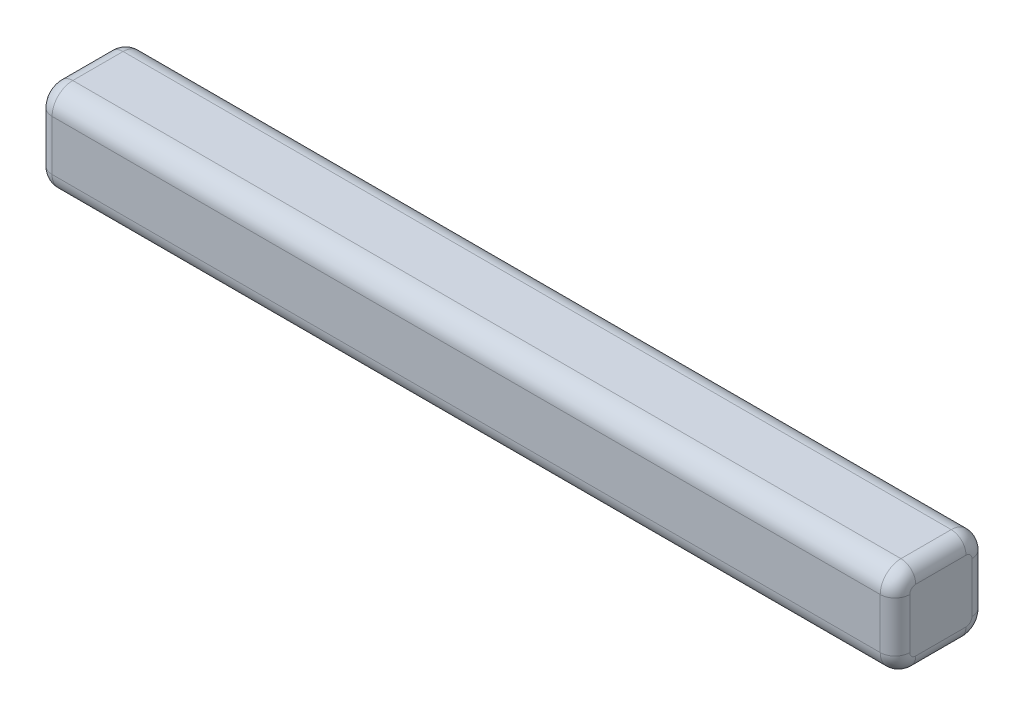
ISO-10303-21;
HEADER;
FILE_DESCRIPTION(('STEP AP214'),'2;1');
FILE_NAME('part.step','',(''),(''),'','','');
FILE_SCHEMA(('AUTOMOTIVE_DESIGN { 1 0 10303 214 1 1 1 1 }'));
ENDSEC;
DATA;
#1=APPLICATION_CONTEXT('core data for automotive mechanical design processes');
#2=APPLICATION_PROTOCOL_DEFINITION('international standard','automotive_design',2000,#1);
#3=PRODUCT_CONTEXT('',#1,'mechanical');
#4=PRODUCT('Part','Part','',(#3));
#5=PRODUCT_RELATED_PRODUCT_CATEGORY('part','',(#4));
#6=PRODUCT_DEFINITION_FORMATION('','',#4);
#7=PRODUCT_DEFINITION_CONTEXT('part definition',#1,'design');
#8=PRODUCT_DEFINITION('design','',#6,#7);
#9=PRODUCT_DEFINITION_SHAPE('','',#8);
#10=(LENGTH_UNIT() NAMED_UNIT(*) SI_UNIT(.MILLI.,.METRE.));
#11=(NAMED_UNIT(*) PLANE_ANGLE_UNIT() SI_UNIT($,.RADIAN.));
#12=(NAMED_UNIT(*) SI_UNIT($,.STERADIAN.) SOLID_ANGLE_UNIT());
#13=UNCERTAINTY_MEASURE_WITH_UNIT(LENGTH_MEASURE(1.E-05),#10,'distance_accuracy_value','');
#14=(GEOMETRIC_REPRESENTATION_CONTEXT(3) GLOBAL_UNCERTAINTY_ASSIGNED_CONTEXT((#13)) GLOBAL_UNIT_ASSIGNED_CONTEXT((#10,
#11,#12)) REPRESENTATION_CONTEXT('',''));
#15=CARTESIAN_POINT('',(0.,0.,0.));
#16=DIRECTION('',(0.,0.,1.));
#17=DIRECTION('',(1.,0.,0.));
#18=AXIS2_PLACEMENT_3D('',#15,#16,#17);
#19=CARTESIAN_POINT('',(11.4400713575457,0.,0.));
#20=DIRECTION('',(1.,0.,0.));
#21=DIRECTION('',(0.,0.,-1.));
#22=AXIS2_PLACEMENT_3D('',#19,#20,#21);
#23=PLANE('',#22);
#24=DIRECTION('',(0.,-1.,0.));
#25=VECTOR('',#24,1.);
#26=CARTESIAN_POINT('',(11.4400713575457,0.,39.8435567964381));
#27=LINE('',#26,#25);
#28=CARTESIAN_POINT('',(11.4400713575457,141.724028512687,39.8435567964381));
#29=VERTEX_POINT('',#28);
#30=CARTESIAN_POINT('',(11.4400713575457,143.424028512687,39.8435567964381));
#31=VERTEX_POINT('',#30);
#32=EDGE_CURVE('E50',#29,#31,#27,.F.);
#33=ORIENTED_EDGE('',*,*,#32,.T.);
#34=CARTESIAN_POINT('',(11.4400713575457,143.424028512687,39.6435567964381));
#35=DIRECTION('',(1.,0.,0.));
#36=DIRECTION('',(0.,0.,-1.));
#37=AXIS2_PLACEMENT_3D('',#34,#35,#36);
#38=CIRCLE('',#37,0.2);
#39=CARTESIAN_POINT('',(11.4400713575457,143.624028512687,39.6435567964381));
#40=VERTEX_POINT('',#39);
#41=EDGE_CURVE('E11',#31,#40,#38,.F.);
#42=ORIENTED_EDGE('',*,*,#41,.T.);
#43=DIRECTION('',(0.,0.,1.));
#44=VECTOR('',#43,1.);
#45=CARTESIAN_POINT('',(11.4400713575457,143.624028512687,0.));
#46=LINE('',#45,#44);
#47=CARTESIAN_POINT('',(11.4400713575457,143.624028512687,37.9435567964381));
#48=VERTEX_POINT('',#47);
#49=EDGE_CURVE('E217',#40,#48,#46,.F.);
#50=ORIENTED_EDGE('',*,*,#49,.T.);
#51=CARTESIAN_POINT('',(11.4400713575457,143.424028512687,37.9435567964381));
#52=DIRECTION('',(1.,0.,0.));
#53=DIRECTION('',(0.,0.,-1.));
#54=AXIS2_PLACEMENT_3D('',#51,#52,#53);
#55=CIRCLE('',#54,0.2);
#56=CARTESIAN_POINT('',(11.4400713575457,143.424028512687,37.7435567964381));
#57=VERTEX_POINT('',#56);
#58=EDGE_CURVE('E219',#48,#57,#55,.F.);
#59=ORIENTED_EDGE('',*,*,#58,.T.);
#60=DIRECTION('',(0.,1.,0.));
#61=VECTOR('',#60,1.);
#62=CARTESIAN_POINT('',(11.4400713575457,0.,37.7435567964381));
#63=LINE('',#62,#61);
#64=CARTESIAN_POINT('',(11.4400713575457,141.724028512687,37.7435567964381));
#65=VERTEX_POINT('',#64);
#66=EDGE_CURVE('E221',#57,#65,#63,.F.);
#67=ORIENTED_EDGE('',*,*,#66,.T.);
#68=CARTESIAN_POINT('',(11.4400713575457,141.724028512687,37.9435567964381));
#69=DIRECTION('',(1.,0.,0.));
#70=DIRECTION('',(0.,0.,-1.));
#71=AXIS2_PLACEMENT_3D('',#68,#69,#70);
#72=CIRCLE('',#71,0.2);
#73=CARTESIAN_POINT('',(11.4400713575457,141.524028512687,37.9435567964381));
#74=VERTEX_POINT('',#73);
#75=EDGE_CURVE('E223',#65,#74,#72,.F.);
#76=ORIENTED_EDGE('',*,*,#75,.T.);
#77=DIRECTION('',(0.,0.,-1.));
#78=VECTOR('',#77,1.);
#79=CARTESIAN_POINT('',(11.4400713575457,141.524028512687,0.));
#80=LINE('',#79,#78);
#81=CARTESIAN_POINT('',(11.4400713575457,141.524028512687,39.6435567964381));
#82=VERTEX_POINT('',#81);
#83=EDGE_CURVE('E225',#74,#82,#80,.F.);
#84=ORIENTED_EDGE('',*,*,#83,.T.);
#85=CARTESIAN_POINT('',(11.4400713575457,141.724028512687,39.6435567964381));
#86=DIRECTION('',(1.,0.,0.));
#87=DIRECTION('',(0.,0.,-1.));
#88=AXIS2_PLACEMENT_3D('',#85,#86,#87);
#89=CIRCLE('',#88,0.2);
#90=EDGE_CURVE('E61',#82,#29,#89,.F.);
#91=ORIENTED_EDGE('',*,*,#90,.T.);
#92=EDGE_LOOP('',(#33,#42,#50,#59,#67,#76,#84,#91));
#93=FACE_BOUND('',#92,.T.);
#94=ADVANCED_FACE('F41',(#93),#23,.F.);
#95=CARTESIAN_POINT('',(44.8241334009023,144.124028512687,42.7935567964381));
#96=DIRECTION('',(0.,-1.,0.));
#97=DIRECTION('',(0.,0.,-1.));
#98=AXIS2_PLACEMENT_3D('',#95,#96,#97);
#99=PLANE('',#98);
#100=DIRECTION('',(-1.,0.,0.));
#101=VECTOR('',#100,1.);
#102=CARTESIAN_POINT('',(44.8241334009023,144.124028512687,39.6435567964381));
#103=LINE('',#102,#101);
#104=CARTESIAN_POINT('',(11.9400713575457,144.124028512687,39.6435567964381));
#105=VERTEX_POINT('',#104);
#106=CARTESIAN_POINT('',(39.9400713575457,144.124028512687,39.6435567964381));
#107=VERTEX_POINT('',#106);
#108=EDGE_CURVE('E246',#105,#107,#103,.F.);
#109=ORIENTED_EDGE('',*,*,#108,.T.);
#110=DIRECTION('',(0.,0.,-1.));
#111=VECTOR('',#110,1.);
#112=CARTESIAN_POINT('',(39.9400713575457,144.124028512687,42.7935567964381));
#113=LINE('',#112,#111);
#114=CARTESIAN_POINT('',(39.9400713575457,144.124028512687,37.9435567964381));
#115=VERTEX_POINT('',#114);
#116=EDGE_CURVE('E207',#107,#115,#113,.T.);
#117=ORIENTED_EDGE('',*,*,#116,.T.);
#118=DIRECTION('',(-1.,0.,0.));
#119=VECTOR('',#118,1.);
#120=CARTESIAN_POINT('',(44.8241334009023,144.124028512687,37.9435567964381));
#121=LINE('',#120,#119);
#122=CARTESIAN_POINT('',(11.9400713575457,144.124028512687,37.9435567964381));
#123=VERTEX_POINT('',#122);
#124=EDGE_CURVE('E290',#115,#123,#121,.T.);
#125=ORIENTED_EDGE('',*,*,#124,.T.);
#126=DIRECTION('',(0.,0.,1.));
#127=VECTOR('',#126,1.);
#128=CARTESIAN_POINT('',(11.9400713575457,144.124028512687,42.7935567964381));
#129=LINE('',#128,#127);
#130=EDGE_CURVE('E205',#123,#105,#129,.T.);
#131=ORIENTED_EDGE('',*,*,#130,.T.);
#132=EDGE_LOOP('',(#109,#117,#125,#131));
#133=FACE_BOUND('',#132,.T.);
#134=ADVANCED_FACE('F353',(#133),#99,.F.);
#135=CARTESIAN_POINT('',(44.8241334009023,-16.4259714873127,37.2435567964381));
#136=DIRECTION('',(0.,0.,1.));
#137=DIRECTION('',(1.,0.,0.));
#138=AXIS2_PLACEMENT_3D('',#135,#136,#137);
#139=PLANE('',#138);
#140=DIRECTION('',(-1.,0.,0.));
#141=VECTOR('',#140,1.);
#142=CARTESIAN_POINT('',(44.8241334009023,143.424028512687,37.2435567964381));
#143=LINE('',#142,#141);
#144=CARTESIAN_POINT('',(11.9400713575457,143.424028512687,37.2435567964381));
#145=VERTEX_POINT('',#144);
#146=CARTESIAN_POINT('',(39.9400713575457,143.424028512687,37.2435567964381));
#147=VERTEX_POINT('',#146);
#148=EDGE_CURVE('E289',#145,#147,#143,.F.);
#149=ORIENTED_EDGE('',*,*,#148,.T.);
#150=DIRECTION('',(0.,-1.,0.));
#151=VECTOR('',#150,1.);
#152=CARTESIAN_POINT('',(39.9400713575457,-16.4259714873127,37.2435567964381));
#153=LINE('',#152,#151);
#154=CARTESIAN_POINT('',(39.9400713575457,141.724028512687,37.2435567964381));
#155=VERTEX_POINT('',#154);
#156=EDGE_CURVE('E215',#147,#155,#153,.T.);
#157=ORIENTED_EDGE('',*,*,#156,.T.);
#158=DIRECTION('',(-1.,0.,0.));
#159=VECTOR('',#158,1.);
#160=CARTESIAN_POINT('',(44.8241334009023,141.724028512687,37.2435567964381));
#161=LINE('',#160,#159);
#162=CARTESIAN_POINT('',(11.9400713575457,141.724028512687,37.2435567964381));
#163=VERTEX_POINT('',#162);
#164=EDGE_CURVE('E283',#155,#163,#161,.T.);
#165=ORIENTED_EDGE('',*,*,#164,.T.);
#166=DIRECTION('',(0.,1.,0.));
#167=VECTOR('',#166,1.);
#168=CARTESIAN_POINT('',(11.9400713575457,-16.4259714873127,37.2435567964381));
#169=LINE('',#168,#167);
#170=EDGE_CURVE('E213',#163,#145,#169,.T.);
#171=ORIENTED_EDGE('',*,*,#170,.T.);
#172=EDGE_LOOP('',(#149,#157,#165,#171));
#173=FACE_BOUND('',#172,.T.);
#174=ADVANCED_FACE('F287',(#173),#139,.F.);
#175=CARTESIAN_POINT('',(44.8241334009023,141.024028512687,42.7935567964381));
#176=DIRECTION('',(0.,1.,0.));
#177=DIRECTION('',(0.,0.,1.));
#178=AXIS2_PLACEMENT_3D('',#175,#176,#177);
#179=PLANE('',#178);
#180=DIRECTION('',(-1.,0.,0.));
#181=VECTOR('',#180,1.);
#182=CARTESIAN_POINT('',(44.8241334009023,141.024028512687,37.9435567964381));
#183=LINE('',#182,#181);
#184=CARTESIAN_POINT('',(11.9400713575457,141.024028512687,37.9435567964381));
#185=VERTEX_POINT('',#184);
#186=CARTESIAN_POINT('',(39.9400713575457,141.024028512687,37.9435567964381));
#187=VERTEX_POINT('',#186);
#188=EDGE_CURVE('E174',#185,#187,#183,.F.);
#189=ORIENTED_EDGE('',*,*,#188,.T.);
#190=DIRECTION('',(0.,0.,1.));
#191=VECTOR('',#190,1.);
#192=CARTESIAN_POINT('',(39.9400713575457,141.024028512687,42.7935567964381));
#193=LINE('',#192,#191);
#194=CARTESIAN_POINT('',(39.9400713575457,141.024028512687,39.6435567964381));
#195=VERTEX_POINT('',#194);
#196=EDGE_CURVE('E190',#187,#195,#193,.T.);
#197=ORIENTED_EDGE('',*,*,#196,.T.);
#198=DIRECTION('',(-1.,0.,0.));
#199=VECTOR('',#198,1.);
#200=CARTESIAN_POINT('',(44.8241334009023,141.024028512687,39.6435567964381));
#201=LINE('',#200,#199);
#202=CARTESIAN_POINT('',(11.9400713575457,141.024028512687,39.6435567964381));
#203=VERTEX_POINT('',#202);
#204=EDGE_CURVE('E303',#195,#203,#201,.T.);
#205=ORIENTED_EDGE('',*,*,#204,.T.);
#206=DIRECTION('',(0.,0.,-1.));
#207=VECTOR('',#206,1.);
#208=CARTESIAN_POINT('',(11.9400713575457,141.024028512687,42.7935567964381));
#209=LINE('',#208,#207);
#210=EDGE_CURVE('E188',#203,#185,#209,.T.);
#211=ORIENTED_EDGE('',*,*,#210,.T.);
#212=EDGE_LOOP('',(#189,#197,#205,#211));
#213=FACE_BOUND('',#212,.T.);
#214=ADVANCED_FACE('F325',(#213),#179,.F.);
#215=CARTESIAN_POINT('',(44.8241334009023,-16.4259714873127,40.3435567964381));
#216=DIRECTION('',(0.,0.,-1.));
#217=DIRECTION('',(-1.,0.,0.));
#218=AXIS2_PLACEMENT_3D('',#215,#216,#217);
#219=PLANE('',#218);
#220=DIRECTION('',(-1.,0.,0.));
#221=VECTOR('',#220,1.);
#222=CARTESIAN_POINT('',(44.8241334009023,141.724028512687,40.3435567964381));
#223=LINE('',#222,#221);
#224=CARTESIAN_POINT('',(11.9400713575457,141.724028512687,40.3435567964381));
#225=VERTEX_POINT('',#224);
#226=CARTESIAN_POINT('',(39.9400713575457,141.724028512687,40.3435567964381));
#227=VERTEX_POINT('',#226);
#228=EDGE_CURVE('E292',#225,#227,#223,.F.);
#229=ORIENTED_EDGE('',*,*,#228,.T.);
#230=DIRECTION('',(0.,1.,0.));
#231=VECTOR('',#230,1.);
#232=CARTESIAN_POINT('',(39.9400713575457,-16.4259714873127,40.3435567964381));
#233=LINE('',#232,#231);
#234=CARTESIAN_POINT('',(39.9400713575457,143.424028512687,40.3435567964381));
#235=VERTEX_POINT('',#234);
#236=EDGE_CURVE('E198',#227,#235,#233,.T.);
#237=ORIENTED_EDGE('',*,*,#236,.T.);
#238=DIRECTION('',(-1.,0.,0.));
#239=VECTOR('',#238,1.);
#240=CARTESIAN_POINT('',(44.8241334009023,143.424028512687,40.3435567964381));
#241=LINE('',#240,#239);
#242=CARTESIAN_POINT('',(11.9400713575457,143.424028512687,40.3435567964381));
#243=VERTEX_POINT('',#242);
#244=EDGE_CURVE('E300',#235,#243,#241,.T.);
#245=ORIENTED_EDGE('',*,*,#244,.T.);
#246=DIRECTION('',(0.,-1.,0.));
#247=VECTOR('',#246,1.);
#248=CARTESIAN_POINT('',(11.9400713575457,-16.4259714873127,40.3435567964381));
#249=LINE('',#248,#247);
#250=EDGE_CURVE('E196',#243,#225,#249,.T.);
#251=ORIENTED_EDGE('',*,*,#250,.T.);
#252=EDGE_LOOP('',(#229,#237,#245,#251));
#253=FACE_BOUND('',#252,.T.);
#254=ADVANCED_FACE('F369',(#253),#219,.F.);
#255=CARTESIAN_POINT('',(40.4400713575457,-16.4259714873127,42.7935567964381));
#256=DIRECTION('',(-1.,0.,0.));
#257=DIRECTION('',(0.,0.,1.));
#258=AXIS2_PLACEMENT_3D('',#255,#256,#257);
#259=PLANE('',#258);
#260=DIRECTION('',(0.,0.,1.));
#261=VECTOR('',#260,1.);
#262=CARTESIAN_POINT('',(40.4400713575457,141.524028512687,42.7935567964381));
#263=LINE('',#262,#261);
#264=CARTESIAN_POINT('',(40.4400713575457,141.524028512687,39.6435567964381));
#265=VERTEX_POINT('',#264);
#266=CARTESIAN_POINT('',(40.4400713575457,141.524028512687,37.9435567964381));
#267=VERTEX_POINT('',#266);
#268=EDGE_CURVE('E178',#265,#267,#263,.F.);
#269=ORIENTED_EDGE('',*,*,#268,.T.);
#270=CARTESIAN_POINT('',(40.4400713575457,141.724028512687,37.9435567964381));
#271=DIRECTION('',(-1.,0.,0.));
#272=DIRECTION('',(0.,0.,1.));
#273=AXIS2_PLACEMENT_3D('',#270,#271,#272);
#274=CIRCLE('',#273,0.2);
#275=CARTESIAN_POINT('',(40.4400713575457,141.724028512687,37.7435567964381));
#276=VERTEX_POINT('',#275);
#277=EDGE_CURVE('E159',#267,#276,#274,.F.);
#278=ORIENTED_EDGE('',*,*,#277,.T.);
#279=DIRECTION('',(0.,-1.,0.));
#280=VECTOR('',#279,1.);
#281=CARTESIAN_POINT('',(40.4400713575457,-16.4259714873127,37.7435567964381));
#282=LINE('',#281,#280);
#283=CARTESIAN_POINT('',(40.4400713575457,143.424028512687,37.7435567964381));
#284=VERTEX_POINT('',#283);
#285=EDGE_CURVE('E167',#276,#284,#282,.F.);
#286=ORIENTED_EDGE('',*,*,#285,.T.);
#287=CARTESIAN_POINT('',(40.4400713575457,143.424028512687,37.9435567964381));
#288=DIRECTION('',(-1.,0.,0.));
#289=DIRECTION('',(0.,0.,1.));
#290=AXIS2_PLACEMENT_3D('',#287,#288,#289);
#291=CIRCLE('',#290,0.2);
#292=CARTESIAN_POINT('',(40.4400713575457,143.624028512687,37.9435567964381));
#293=VERTEX_POINT('',#292);
#294=EDGE_CURVE('E173',#284,#293,#291,.F.);
#295=ORIENTED_EDGE('',*,*,#294,.T.);
#296=DIRECTION('',(0.,0.,-1.));
#297=VECTOR('',#296,1.);
#298=CARTESIAN_POINT('',(40.4400713575457,143.624028512687,42.7935567964381));
#299=LINE('',#298,#297);
#300=CARTESIAN_POINT('',(40.4400713575457,143.624028512687,39.6435567964381));
#301=VERTEX_POINT('',#300);
#302=EDGE_CURVE('E308',#293,#301,#299,.F.);
#303=ORIENTED_EDGE('',*,*,#302,.T.);
#304=CARTESIAN_POINT('',(40.4400713575457,143.424028512687,39.6435567964381));
#305=DIRECTION('',(-1.,0.,0.));
#306=DIRECTION('',(0.,0.,1.));
#307=AXIS2_PLACEMENT_3D('',#304,#305,#306);
#308=CIRCLE('',#307,0.2);
#309=CARTESIAN_POINT('',(40.4400713575457,143.424028512687,39.8435567964381));
#310=VERTEX_POINT('',#309);
#311=EDGE_CURVE('E310',#301,#310,#308,.F.);
#312=ORIENTED_EDGE('',*,*,#311,.T.);
#313=DIRECTION('',(0.,1.,0.));
#314=VECTOR('',#313,1.);
#315=CARTESIAN_POINT('',(40.4400713575457,-16.4259714873127,39.8435567964381));
#316=LINE('',#315,#314);
#317=CARTESIAN_POINT('',(40.4400713575457,141.724028512687,39.8435567964381));
#318=VERTEX_POINT('',#317);
#319=EDGE_CURVE('E312',#310,#318,#316,.F.);
#320=ORIENTED_EDGE('',*,*,#319,.T.);
#321=CARTESIAN_POINT('',(40.4400713575457,141.724028512687,39.6435567964381));
#322=DIRECTION('',(-1.,0.,0.));
#323=DIRECTION('',(0.,0.,1.));
#324=AXIS2_PLACEMENT_3D('',#321,#322,#323);
#325=CIRCLE('',#324,0.2);
#326=EDGE_CURVE('E183',#318,#265,#325,.F.);
#327=ORIENTED_EDGE('',*,*,#326,.T.);
#328=EDGE_LOOP('',(#269,#278,#286,#295,#303,#312,#320,#327));
#329=FACE_BOUND('',#328,.T.);
#330=ADVANCED_FACE('F176',(#329),#259,.F.);
#331=CARTESIAN_POINT('',(44.8241334009023,143.424028512687,37.9435567964381));
#332=DIRECTION('',(-1.,0.,0.));
#333=DIRECTION('',(0.,0.,1.));
#334=AXIS2_PLACEMENT_3D('',#331,#332,#333);
#335=CYLINDRICAL_SURFACE('',#334,0.7);
#336=ORIENTED_EDGE('',*,*,#124,.F.);
#337=CARTESIAN_POINT('',(39.9400713575457,143.424028512687,37.9435567964381));
#338=DIRECTION('',(-1.,0.,0.));
#339=DIRECTION('',(0.,0.,1.));
#340=AXIS2_PLACEMENT_3D('',#337,#338,#339);
#341=CIRCLE('',#340,0.7);
#342=EDGE_CURVE('E211',#115,#147,#341,.T.);
#343=ORIENTED_EDGE('',*,*,#342,.T.);
#344=ORIENTED_EDGE('',*,*,#148,.F.);
#345=CARTESIAN_POINT('',(11.9400713575457,143.424028512687,37.9435567964381));
#346=DIRECTION('',(1.,0.,0.));
#347=DIRECTION('',(0.,0.,-1.));
#348=AXIS2_PLACEMENT_3D('',#345,#346,#347);
#349=CIRCLE('',#348,0.7);
#350=EDGE_CURVE('E209',#145,#123,#349,.T.);
#351=ORIENTED_EDGE('',*,*,#350,.T.);
#352=EDGE_LOOP('',(#336,#343,#344,#351));
#353=FACE_BOUND('',#352,.T.);
#354=ADVANCED_FACE('F376',(#353),#335,.T.);
#355=CARTESIAN_POINT('',(44.8241334009023,143.424028512687,39.6435567964381));
#356=DIRECTION('',(-1.,0.,0.));
#357=DIRECTION('',(0.,0.,1.));
#358=AXIS2_PLACEMENT_3D('',#355,#356,#357);
#359=CYLINDRICAL_SURFACE('',#358,0.7);
#360=ORIENTED_EDGE('',*,*,#244,.F.);
#361=CARTESIAN_POINT('',(39.9400713575457,143.424028512687,39.6435567964381));
#362=DIRECTION('',(-1.,0.,0.));
#363=DIRECTION('',(0.,0.,1.));
#364=AXIS2_PLACEMENT_3D('',#361,#362,#363);
#365=CIRCLE('',#364,0.7);
#366=EDGE_CURVE('E203',#235,#107,#365,.T.);
#367=ORIENTED_EDGE('',*,*,#366,.T.);
#368=ORIENTED_EDGE('',*,*,#108,.F.);
#369=CARTESIAN_POINT('',(11.9400713575457,143.424028512687,39.6435567964381));
#370=DIRECTION('',(1.,0.,0.));
#371=DIRECTION('',(0.,0.,-1.));
#372=AXIS2_PLACEMENT_3D('',#369,#370,#371);
#373=CIRCLE('',#372,0.7);
#374=EDGE_CURVE('E200',#105,#243,#373,.T.);
#375=ORIENTED_EDGE('',*,*,#374,.T.);
#376=EDGE_LOOP('',(#360,#367,#368,#375));
#377=FACE_BOUND('',#376,.T.);
#378=ADVANCED_FACE('F358',(#377),#359,.T.);
#379=CARTESIAN_POINT('',(44.8241334009023,141.724028512687,37.9435567964381));
#380=DIRECTION('',(-1.,0.,0.));
#381=DIRECTION('',(0.,0.,1.));
#382=AXIS2_PLACEMENT_3D('',#379,#380,#381);
#383=CYLINDRICAL_SURFACE('',#382,0.7);
#384=ORIENTED_EDGE('',*,*,#164,.F.);
#385=CARTESIAN_POINT('',(39.9400713575457,141.724028512687,37.9435567964381));
#386=DIRECTION('',(-1.,0.,0.));
#387=DIRECTION('',(0.,0.,1.));
#388=AXIS2_PLACEMENT_3D('',#385,#386,#387);
#389=CIRCLE('',#388,0.7);
#390=EDGE_CURVE('E161',#155,#187,#389,.T.);
#391=ORIENTED_EDGE('',*,*,#390,.T.);
#392=ORIENTED_EDGE('',*,*,#188,.F.);
#393=CARTESIAN_POINT('',(11.9400713575457,141.724028512687,37.9435567964381));
#394=DIRECTION('',(1.,0.,0.));
#395=DIRECTION('',(0.,0.,-1.));
#396=AXIS2_PLACEMENT_3D('',#393,#394,#395);
#397=CIRCLE('',#396,0.7);
#398=EDGE_CURVE('E180',#185,#163,#397,.T.);
#399=ORIENTED_EDGE('',*,*,#398,.T.);
#400=EDGE_LOOP('',(#384,#391,#392,#399));
#401=FACE_BOUND('',#400,.T.);
#402=ADVANCED_FACE('F282',(#401),#383,.T.);
#403=CARTESIAN_POINT('',(44.8241334009023,141.724028512687,39.6435567964381));
#404=DIRECTION('',(-1.,0.,0.));
#405=DIRECTION('',(0.,0.,1.));
#406=AXIS2_PLACEMENT_3D('',#403,#404,#405);
#407=CYLINDRICAL_SURFACE('',#406,0.7);
#408=ORIENTED_EDGE('',*,*,#204,.F.);
#409=CARTESIAN_POINT('',(39.9400713575457,141.724028512687,39.6435567964381));
#410=DIRECTION('',(-1.,0.,0.));
#411=DIRECTION('',(0.,0.,1.));
#412=AXIS2_PLACEMENT_3D('',#409,#410,#411);
#413=CIRCLE('',#412,0.7);
#414=EDGE_CURVE('E194',#195,#227,#413,.T.);
#415=ORIENTED_EDGE('',*,*,#414,.T.);
#416=ORIENTED_EDGE('',*,*,#228,.F.);
#417=CARTESIAN_POINT('',(11.9400713575457,141.724028512687,39.6435567964381));
#418=DIRECTION('',(1.,0.,0.));
#419=DIRECTION('',(0.,0.,-1.));
#420=AXIS2_PLACEMENT_3D('',#417,#418,#419);
#421=CIRCLE('',#420,0.7);
#422=EDGE_CURVE('E192',#225,#203,#421,.T.);
#423=ORIENTED_EDGE('',*,*,#422,.T.);
#424=EDGE_LOOP('',(#408,#415,#416,#423));
#425=FACE_BOUND('',#424,.T.);
#426=ADVANCED_FACE('F327',(#425),#407,.T.);
#427=CARTESIAN_POINT('',(39.9400713575457,143.424028512687,39.6435567964381));
#428=DIRECTION('',(-1.,0.,0.));
#429=DIRECTION('',(0.,0.,1.));
#430=AXIS2_PLACEMENT_3D('',#427,#428,#429);
#431=DEGENERATE_TOROIDAL_SURFACE('',#430,0.2,0.5,.T.);
#432=CARTESIAN_POINT('',(39.9400713575457,143.624028512687,39.6435567964381));
#433=DIRECTION('',(0.,0.,-1.));
#434=DIRECTION('',(-1.,0.,0.));
#435=AXIS2_PLACEMENT_3D('',#432,#433,#434);
#436=CIRCLE('',#435,0.5);
#437=EDGE_CURVE('E240',#107,#301,#436,.T.);
#438=ORIENTED_EDGE('',*,*,#437,.F.);
#439=ORIENTED_EDGE('',*,*,#366,.F.);
#440=CARTESIAN_POINT('',(39.9400713575457,143.424028512687,39.8435567964381));
#441=DIRECTION('',(0.,-1.,0.));
#442=DIRECTION('',(0.,0.,-1.));
#443=AXIS2_PLACEMENT_3D('',#440,#441,#442);
#444=CIRCLE('',#443,0.5);
#445=EDGE_CURVE('E243',#310,#235,#444,.T.);
#446=ORIENTED_EDGE('',*,*,#445,.F.);
#447=ORIENTED_EDGE('',*,*,#311,.F.);
#448=EDGE_LOOP('',(#438,#439,#446,#447));
#449=FACE_BOUND('',#448,.T.);
#450=ADVANCED_FACE('F362',(#449),#431,.T.);
#451=CARTESIAN_POINT('',(39.9400713575457,-16.4259714873127,39.8435567964381));
#452=DIRECTION('',(0.,1.,0.));
#453=DIRECTION('',(0.,0.,1.));
#454=AXIS2_PLACEMENT_3D('',#451,#452,#453);
#455=CYLINDRICAL_SURFACE('',#454,0.5);
#456=ORIENTED_EDGE('',*,*,#445,.T.);
#457=ORIENTED_EDGE('',*,*,#236,.F.);
#458=CARTESIAN_POINT('',(39.9400713575457,141.724028512687,39.8435567964381));
#459=DIRECTION('',(0.,-1.,0.));
#460=DIRECTION('',(0.,0.,-1.));
#461=AXIS2_PLACEMENT_3D('',#458,#459,#460);
#462=CIRCLE('',#461,0.5);
#463=EDGE_CURVE('E237',#318,#227,#462,.T.);
#464=ORIENTED_EDGE('',*,*,#463,.F.);
#465=ORIENTED_EDGE('',*,*,#319,.F.);
#466=EDGE_LOOP('',(#456,#457,#464,#465));
#467=FACE_BOUND('',#466,.T.);
#468=ADVANCED_FACE('F367',(#467),#455,.T.);
#469=CARTESIAN_POINT('',(39.9400713575457,143.624028512687,42.7935567964381));
#470=DIRECTION('',(0.,0.,-1.));
#471=DIRECTION('',(-1.,0.,0.));
#472=AXIS2_PLACEMENT_3D('',#469,#470,#471);
#473=CYLINDRICAL_SURFACE('',#472,0.5);
#474=ORIENTED_EDGE('',*,*,#437,.T.);
#475=ORIENTED_EDGE('',*,*,#302,.F.);
#476=CARTESIAN_POINT('',(39.9400713575457,143.624028512687,37.9435567964381));
#477=DIRECTION('',(0.,0.,-1.));
#478=DIRECTION('',(-1.,0.,0.));
#479=AXIS2_PLACEMENT_3D('',#476,#477,#478);
#480=CIRCLE('',#479,0.5);
#481=EDGE_CURVE('E234',#115,#293,#480,.T.);
#482=ORIENTED_EDGE('',*,*,#481,.F.);
#483=ORIENTED_EDGE('',*,*,#116,.F.);
#484=EDGE_LOOP('',(#474,#475,#482,#483));
#485=FACE_BOUND('',#484,.T.);
#486=ADVANCED_FACE('F458',(#485),#473,.T.);
#487=CARTESIAN_POINT('',(39.9400713575457,141.724028512687,39.6435567964381));
#488=DIRECTION('',(-1.,0.,0.));
#489=DIRECTION('',(0.,0.,1.));
#490=AXIS2_PLACEMENT_3D('',#487,#488,#489);
#491=DEGENERATE_TOROIDAL_SURFACE('',#490,0.2,0.5,.T.);
#492=ORIENTED_EDGE('',*,*,#463,.T.);
#493=ORIENTED_EDGE('',*,*,#414,.F.);
#494=CARTESIAN_POINT('',(39.9400713575457,141.524028512687,39.6435567964381));
#495=DIRECTION('',(0.,0.,-1.));
#496=DIRECTION('',(-1.,0.,0.));
#497=AXIS2_PLACEMENT_3D('',#494,#495,#496);
#498=CIRCLE('',#497,0.5);
#499=EDGE_CURVE('E231',#265,#195,#498,.T.);
#500=ORIENTED_EDGE('',*,*,#499,.F.);
#501=ORIENTED_EDGE('',*,*,#326,.F.);
#502=EDGE_LOOP('',(#492,#493,#500,#501));
#503=FACE_BOUND('',#502,.T.);
#504=ADVANCED_FACE('F319',(#503),#491,.T.);
#505=CARTESIAN_POINT('',(39.9400713575457,143.424028512687,37.9435567964381));
#506=DIRECTION('',(-1.,0.,0.));
#507=DIRECTION('',(0.,0.,1.));
#508=AXIS2_PLACEMENT_3D('',#505,#506,#507);
#509=DEGENERATE_TOROIDAL_SURFACE('',#508,0.2,0.5,.T.);
#510=ORIENTED_EDGE('',*,*,#481,.T.);
#511=ORIENTED_EDGE('',*,*,#294,.F.);
#512=CARTESIAN_POINT('',(39.9400713575457,143.424028512687,37.7435567964381));
#513=DIRECTION('',(0.,-1.,0.));
#514=DIRECTION('',(0.,0.,-1.));
#515=AXIS2_PLACEMENT_3D('',#512,#513,#514);
#516=CIRCLE('',#515,0.5);
#517=EDGE_CURVE('E170',#147,#284,#516,.T.);
#518=ORIENTED_EDGE('',*,*,#517,.F.);
#519=ORIENTED_EDGE('',*,*,#342,.F.);
#520=EDGE_LOOP('',(#510,#511,#518,#519));
#521=FACE_BOUND('',#520,.T.);
#522=ADVANCED_FACE('F476',(#521),#509,.T.);
#523=CARTESIAN_POINT('',(39.9400713575457,141.524028512687,42.7935567964381));
#524=DIRECTION('',(0.,0.,1.));
#525=DIRECTION('',(1.,0.,0.));
#526=AXIS2_PLACEMENT_3D('',#523,#524,#525);
#527=CYLINDRICAL_SURFACE('',#526,0.5);
#528=ORIENTED_EDGE('',*,*,#499,.T.);
#529=ORIENTED_EDGE('',*,*,#196,.F.);
#530=CARTESIAN_POINT('',(39.9400713575457,141.524028512687,37.9435567964381));
#531=DIRECTION('',(0.,0.,-1.));
#532=DIRECTION('',(-1.,0.,0.));
#533=AXIS2_PLACEMENT_3D('',#530,#531,#532);
#534=CIRCLE('',#533,0.5);
#535=EDGE_CURVE('E164',#267,#187,#534,.T.);
#536=ORIENTED_EDGE('',*,*,#535,.F.);
#537=ORIENTED_EDGE('',*,*,#268,.F.);
#538=EDGE_LOOP('',(#528,#529,#536,#537));
#539=FACE_BOUND('',#538,.T.);
#540=ADVANCED_FACE('F322',(#539),#527,.T.);
#541=CARTESIAN_POINT('',(39.9400713575457,-16.4259714873127,37.7435567964381));
#542=DIRECTION('',(0.,-1.,0.));
#543=DIRECTION('',(0.,0.,-1.));
#544=AXIS2_PLACEMENT_3D('',#541,#542,#543);
#545=CYLINDRICAL_SURFACE('',#544,0.5);
#546=ORIENTED_EDGE('',*,*,#517,.T.);
#547=ORIENTED_EDGE('',*,*,#285,.F.);
#548=CARTESIAN_POINT('',(39.9400713575457,141.724028512687,37.7435567964381));
#549=DIRECTION('',(0.,-1.,0.));
#550=DIRECTION('',(0.,0.,-1.));
#551=AXIS2_PLACEMENT_3D('',#548,#549,#550);
#552=CIRCLE('',#551,0.5);
#553=EDGE_CURVE('E155',#155,#276,#552,.T.);
#554=ORIENTED_EDGE('',*,*,#553,.F.);
#555=ORIENTED_EDGE('',*,*,#156,.F.);
#556=EDGE_LOOP('',(#546,#547,#554,#555));
#557=FACE_BOUND('',#556,.T.);
#558=ADVANCED_FACE('F168',(#557),#545,.T.);
#559=CARTESIAN_POINT('',(39.9400713575457,141.724028512687,37.9435567964381));
#560=DIRECTION('',(-1.,0.,0.));
#561=DIRECTION('',(0.,0.,1.));
#562=AXIS2_PLACEMENT_3D('',#559,#560,#561);
#563=DEGENERATE_TOROIDAL_SURFACE('',#562,0.2,0.5,.T.);
#564=ORIENTED_EDGE('',*,*,#535,.T.);
#565=ORIENTED_EDGE('',*,*,#390,.F.);
#566=ORIENTED_EDGE('',*,*,#553,.T.);
#567=ORIENTED_EDGE('',*,*,#277,.F.);
#568=EDGE_LOOP('',(#564,#565,#566,#567));
#569=FACE_BOUND('',#568,.T.);
#570=ADVANCED_FACE('F157',(#569),#563,.T.);
#571=CARTESIAN_POINT('',(11.9400713575457,141.724028512687,37.9435567964381));
#572=DIRECTION('',(1.,0.,0.));
#573=DIRECTION('',(0.,0.,-1.));
#574=AXIS2_PLACEMENT_3D('',#571,#572,#573);
#575=DEGENERATE_TOROIDAL_SURFACE('',#574,0.2,0.5,.T.);
#576=CARTESIAN_POINT('',(11.9400713575457,141.724028512687,37.7435567964381));
#577=DIRECTION('',(0.,1.,0.));
#578=DIRECTION('',(0.,0.,1.));
#579=AXIS2_PLACEMENT_3D('',#576,#577,#578);
#580=CIRCLE('',#579,0.5);
#581=EDGE_CURVE('E262',#163,#65,#580,.T.);
#582=ORIENTED_EDGE('',*,*,#581,.F.);
#583=ORIENTED_EDGE('',*,*,#398,.F.);
#584=CARTESIAN_POINT('',(11.9400713575457,141.524028512687,37.9435567964381));
#585=DIRECTION('',(0.,0.,1.));
#586=DIRECTION('',(1.,0.,0.));
#587=AXIS2_PLACEMENT_3D('',#584,#585,#586);
#588=CIRCLE('',#587,0.5);
#589=EDGE_CURVE('E45',#74,#185,#588,.T.);
#590=ORIENTED_EDGE('',*,*,#589,.F.);
#591=ORIENTED_EDGE('',*,*,#75,.F.);
#592=EDGE_LOOP('',(#582,#583,#590,#591));
#593=FACE_BOUND('',#592,.T.);
#594=ADVANCED_FACE('F43',(#593),#575,.T.);
#595=CARTESIAN_POINT('',(11.9400713575457,141.524028512687,42.7935567964381));
#596=DIRECTION('',(0.,0.,-1.));
#597=DIRECTION('',(-1.,0.,0.));
#598=AXIS2_PLACEMENT_3D('',#595,#596,#597);
#599=CYLINDRICAL_SURFACE('',#598,0.5);
#600=ORIENTED_EDGE('',*,*,#589,.T.);
#601=ORIENTED_EDGE('',*,*,#210,.F.);
#602=CARTESIAN_POINT('',(11.9400713575457,141.524028512687,39.6435567964381));
#603=DIRECTION('',(0.,0.,1.));
#604=DIRECTION('',(1.,0.,0.));
#605=AXIS2_PLACEMENT_3D('',#602,#603,#604);
#606=CIRCLE('',#605,0.5);
#607=EDGE_CURVE('E260',#82,#203,#606,.T.);
#608=ORIENTED_EDGE('',*,*,#607,.F.);
#609=ORIENTED_EDGE('',*,*,#83,.F.);
#610=EDGE_LOOP('',(#600,#601,#608,#609));
#611=FACE_BOUND('',#610,.T.);
#612=ADVANCED_FACE('F273',(#611),#599,.T.);
#613=CARTESIAN_POINT('',(11.9400713575457,-16.4259714873127,37.7435567964381));
#614=DIRECTION('',(0.,1.,0.));
#615=DIRECTION('',(0.,0.,1.));
#616=AXIS2_PLACEMENT_3D('',#613,#614,#615);
#617=CYLINDRICAL_SURFACE('',#616,0.5);
#618=ORIENTED_EDGE('',*,*,#581,.T.);
#619=ORIENTED_EDGE('',*,*,#66,.F.);
#620=CARTESIAN_POINT('',(11.9400713575457,143.424028512687,37.7435567964381));
#621=DIRECTION('',(0.,1.,0.));
#622=DIRECTION('',(0.,0.,1.));
#623=AXIS2_PLACEMENT_3D('',#620,#621,#622);
#624=CIRCLE('',#623,0.5);
#625=EDGE_CURVE('E257',#145,#57,#624,.T.);
#626=ORIENTED_EDGE('',*,*,#625,.F.);
#627=ORIENTED_EDGE('',*,*,#170,.F.);
#628=EDGE_LOOP('',(#618,#619,#626,#627));
#629=FACE_BOUND('',#628,.T.);
#630=ADVANCED_FACE('F529',(#629),#617,.T.);
#631=CARTESIAN_POINT('',(11.9400713575457,141.724028512687,39.6435567964381));
#632=DIRECTION('',(1.,0.,0.));
#633=DIRECTION('',(0.,0.,-1.));
#634=AXIS2_PLACEMENT_3D('',#631,#632,#633);
#635=DEGENERATE_TOROIDAL_SURFACE('',#634,0.2,0.5,.T.);
#636=ORIENTED_EDGE('',*,*,#607,.T.);
#637=ORIENTED_EDGE('',*,*,#422,.F.);
#638=CARTESIAN_POINT('',(11.9400713575457,141.724028512687,39.8435567964381));
#639=DIRECTION('',(0.,1.,0.));
#640=DIRECTION('',(0.,0.,1.));
#641=AXIS2_PLACEMENT_3D('',#638,#639,#640);
#642=CIRCLE('',#641,0.5);
#643=EDGE_CURVE('E254',#29,#225,#642,.T.);
#644=ORIENTED_EDGE('',*,*,#643,.F.);
#645=ORIENTED_EDGE('',*,*,#90,.F.);
#646=EDGE_LOOP('',(#636,#637,#644,#645));
#647=FACE_BOUND('',#646,.T.);
#648=ADVANCED_FACE('F331',(#647),#635,.T.);
#649=CARTESIAN_POINT('',(11.9400713575457,143.424028512687,37.9435567964381));
#650=DIRECTION('',(1.,0.,0.));
#651=DIRECTION('',(0.,0.,-1.));
#652=AXIS2_PLACEMENT_3D('',#649,#650,#651);
#653=DEGENERATE_TOROIDAL_SURFACE('',#652,0.2,0.5,.T.);
#654=ORIENTED_EDGE('',*,*,#625,.T.);
#655=ORIENTED_EDGE('',*,*,#58,.F.);
#656=CARTESIAN_POINT('',(11.9400713575457,143.624028512687,37.9435567964381));
#657=DIRECTION('',(0.,0.,1.));
#658=DIRECTION('',(1.,0.,0.));
#659=AXIS2_PLACEMENT_3D('',#656,#657,#658);
#660=CIRCLE('',#659,0.5);
#661=EDGE_CURVE('E251',#123,#48,#660,.T.);
#662=ORIENTED_EDGE('',*,*,#661,.F.);
#663=ORIENTED_EDGE('',*,*,#350,.F.);
#664=EDGE_LOOP('',(#654,#655,#662,#663));
#665=FACE_BOUND('',#664,.T.);
#666=ADVANCED_FACE('F345',(#665),#653,.T.);
#667=CARTESIAN_POINT('',(11.9400713575457,-16.4259714873127,39.8435567964381));
#668=DIRECTION('',(0.,-1.,0.));
#669=DIRECTION('',(0.,0.,-1.));
#670=AXIS2_PLACEMENT_3D('',#667,#668,#669);
#671=CYLINDRICAL_SURFACE('',#670,0.5);
#672=ORIENTED_EDGE('',*,*,#643,.T.);
#673=ORIENTED_EDGE('',*,*,#250,.F.);
#674=CARTESIAN_POINT('',(11.9400713575457,143.424028512687,39.8435567964381));
#675=DIRECTION('',(0.,1.,0.));
#676=DIRECTION('',(0.,0.,1.));
#677=AXIS2_PLACEMENT_3D('',#674,#675,#676);
#678=CIRCLE('',#677,0.5);
#679=EDGE_CURVE('E249',#31,#243,#678,.T.);
#680=ORIENTED_EDGE('',*,*,#679,.F.);
#681=ORIENTED_EDGE('',*,*,#32,.F.);
#682=EDGE_LOOP('',(#672,#673,#680,#681));
#683=FACE_BOUND('',#682,.T.);
#684=ADVANCED_FACE('F334',(#683),#671,.T.);
#685=CARTESIAN_POINT('',(11.9400713575457,143.624028512687,42.7935567964381));
#686=DIRECTION('',(0.,0.,1.));
#687=DIRECTION('',(1.,0.,0.));
#688=AXIS2_PLACEMENT_3D('',#685,#686,#687);
#689=CYLINDRICAL_SURFACE('',#688,0.5);
#690=ORIENTED_EDGE('',*,*,#661,.T.);
#691=ORIENTED_EDGE('',*,*,#49,.F.);
#692=CARTESIAN_POINT('',(11.9400713575457,143.624028512687,39.6435567964381));
#693=DIRECTION('',(0.,0.,1.));
#694=DIRECTION('',(1.,0.,0.));
#695=AXIS2_PLACEMENT_3D('',#692,#693,#694);
#696=CIRCLE('',#695,0.5);
#697=EDGE_CURVE('E247',#105,#40,#696,.T.);
#698=ORIENTED_EDGE('',*,*,#697,.F.);
#699=ORIENTED_EDGE('',*,*,#130,.F.);
#700=EDGE_LOOP('',(#690,#691,#698,#699));
#701=FACE_BOUND('',#700,.T.);
#702=ADVANCED_FACE('F349',(#701),#689,.T.);
#703=CARTESIAN_POINT('',(11.9400713575457,143.424028512687,39.6435567964381));
#704=DIRECTION('',(1.,0.,0.));
#705=DIRECTION('',(0.,0.,-1.));
#706=AXIS2_PLACEMENT_3D('',#703,#704,#705);
#707=DEGENERATE_TOROIDAL_SURFACE('',#706,0.2,0.5,.T.);
#708=ORIENTED_EDGE('',*,*,#679,.T.);
#709=ORIENTED_EDGE('',*,*,#374,.F.);
#710=ORIENTED_EDGE('',*,*,#697,.T.);
#711=ORIENTED_EDGE('',*,*,#41,.F.);
#712=EDGE_LOOP('',(#708,#709,#710,#711));
#713=FACE_BOUND('',#712,.T.);
#714=ADVANCED_FACE('F338',(#713),#707,.T.);
#715=CLOSED_SHELL('',(#94,#134,#174,#214,#254,#330,#354,#378,#402,#426,#450,#468,#486,#504,#522,
#540,#558,#570,#594,#612,#630,#648,#666,#684,#702,#714));
#716=MANIFOLD_SOLID_BREP('B2',#715);
#717=ADVANCED_BREP_SHAPE_REPRESENTATION('',(#18,#716),#14);
#718=SHAPE_DEFINITION_REPRESENTATION(#9,#717);
ENDSEC;
END-ISO-10303-21;
